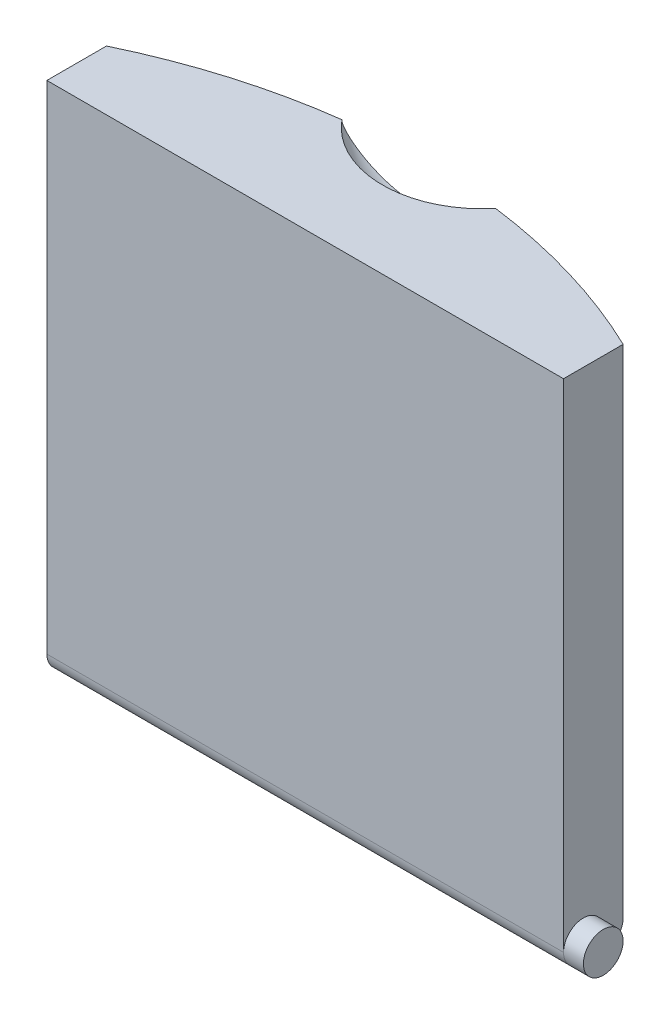
ISO-10303-21;
HEADER;
FILE_DESCRIPTION(('STEP AP214'),'2;1');
FILE_NAME('part.step','',(''),(''),'','','');
FILE_SCHEMA(('AUTOMOTIVE_DESIGN { 1 0 10303 214 1 1 1 1 }'));
ENDSEC;
DATA;
#1=APPLICATION_CONTEXT('core data for automotive mechanical design processes');
#2=APPLICATION_PROTOCOL_DEFINITION('international standard','automotive_design',2000,#1);
#3=PRODUCT_CONTEXT('',#1,'mechanical');
#4=PRODUCT('Part','Part','',(#3));
#5=PRODUCT_RELATED_PRODUCT_CATEGORY('part','',(#4));
#6=PRODUCT_DEFINITION_FORMATION('','',#4);
#7=PRODUCT_DEFINITION_CONTEXT('part definition',#1,'design');
#8=PRODUCT_DEFINITION('design','',#6,#7);
#9=PRODUCT_DEFINITION_SHAPE('','',#8);
#10=(LENGTH_UNIT() NAMED_UNIT(*) SI_UNIT(.MILLI.,.METRE.));
#11=(NAMED_UNIT(*) PLANE_ANGLE_UNIT() SI_UNIT($,.RADIAN.));
#12=(NAMED_UNIT(*) SI_UNIT($,.STERADIAN.) SOLID_ANGLE_UNIT());
#13=UNCERTAINTY_MEASURE_WITH_UNIT(LENGTH_MEASURE(1.E-05),#10,'distance_accuracy_value','');
#14=(GEOMETRIC_REPRESENTATION_CONTEXT(3) GLOBAL_UNCERTAINTY_ASSIGNED_CONTEXT((#13)) GLOBAL_UNIT_ASSIGNED_CONTEXT((#10,
#11,#12)) REPRESENTATION_CONTEXT('',''));
#15=CARTESIAN_POINT('',(0.,0.,0.));
#16=DIRECTION('',(0.,0.,1.));
#17=DIRECTION('',(1.,0.,0.));
#18=AXIS2_PLACEMENT_3D('',#15,#16,#17);
#19=CARTESIAN_POINT('',(70.2962962962964,12.1111111111111,270.370116691915));
#20=DIRECTION('',(0.,1.,0.));
#21=DIRECTION('',(0.,0.,1.));
#22=AXIS2_PLACEMENT_3D('',#19,#20,#21);
#23=CYLINDRICAL_SURFACE('',#22,300.);
#24=CARTESIAN_POINT('',(-4.73346152312547,12.1109111111111,-20.095949211761));
#25=CARTESIAN_POINT('',(-4.7334695884919,12.2096983862572,-20.095947024403));
#26=CARTESIAN_POINT('',(-4.73105456766467,12.3084684488197,-20.0965709593184));
#27=CARTESIAN_POINT('',(-4.72142905882407,12.5057474755002,-20.0990570928781));
#28=CARTESIAN_POINT('',(-4.71421914592804,12.6042564695094,-20.1009191430183));
#29=CARTESIAN_POINT('',(-4.68551061016439,12.8986938685521,-20.1083318173209));
#30=CARTESIAN_POINT('',(-4.65693278073393,13.0939300238274,-20.1157090777853));
#31=CARTESIAN_POINT('',(-4.58251840007666,13.4776466873471,-20.1348996862998));
#32=CARTESIAN_POINT('',(-4.53695599190762,13.666184993572,-20.1466425624954));
#33=CARTESIAN_POINT('',(-4.4299956647076,14.0384692741772,-20.1741731046302));
#34=CARTESIAN_POINT('',(-4.36859028485535,14.2222129456402,-20.1899626762284));
#35=CARTESIAN_POINT('',(-4.21310649708752,14.6329367979812,-20.2298780579377));
#36=CARTESIAN_POINT('',(-4.11468312514153,14.8581635015922,-20.2551034775059));
#37=CARTESIAN_POINT('',(-3.89855776914275,15.2985052212967,-20.3103540222819));
#38=CARTESIAN_POINT('',(-3.78085014094231,15.5136172532179,-20.3403805526247));
#39=CARTESIAN_POINT('',(-3.52862709363782,15.9349017326551,-20.404534404786));
#40=CARTESIAN_POINT('',(-3.39401065022734,16.1410094696354,-20.4386863229663));
#41=CARTESIAN_POINT('',(-3.11138328498631,16.5431765465567,-20.5101573433655));
#42=CARTESIAN_POINT('',(-2.96337251324218,16.7392359990523,-20.5474764100955));
#43=CARTESIAN_POINT('',(-2.66894543627056,17.1061073423181,-20.6214546854569));
#44=CARTESIAN_POINT('',(-2.52340532315973,17.2776676223088,-20.6579142482495));
#45=CARTESIAN_POINT('',(-2.22441823720289,17.6133967073503,-20.7325622883711));
#46=CARTESIAN_POINT('',(-2.07096973554215,17.7775640716547,-20.7707510998161));
#47=CARTESIAN_POINT('',(-1.75727640700149,18.0991207929627,-20.8485447927769));
#48=CARTESIAN_POINT('',(-1.59702704006541,18.2565054761585,-20.8881506173894));
#49=CARTESIAN_POINT('',(-1.27078778484493,18.5649148964771,-20.9684847713521));
#50=CARTESIAN_POINT('',(-1.10479750620661,18.7159391995707,-21.0092131769938));
#51=CARTESIAN_POINT('',(-0.76766966017575,19.0122925967828,-21.0916181797488));
#52=CARTESIAN_POINT('',(-0.596525924268445,19.157614343917,-21.1332958973478));
#53=CARTESIAN_POINT('',(-0.249942149931736,19.4428158024802,-21.2173659638907));
#54=CARTESIAN_POINT('',(-0.0745020936002573,19.5826954912268,-21.2597583158121));
#55=CARTESIAN_POINT('',(0.28005589749429,19.8573625308599,-21.3450857117869));
#56=CARTESIAN_POINT('',(0.459172173927706,19.9921521032006,-21.3880205079257));
#57=CARTESIAN_POINT('',(0.820711140318799,20.2570727904066,-21.4743240956355));
#58=CARTESIAN_POINT('',(1.00313388316235,20.3872038306609,-21.5176928941433));
#59=CARTESIAN_POINT('',(1.48111923160502,20.719841522649,-21.6308468241577));
#60=CARTESIAN_POINT('',(1.77896644355572,20.918984101038,-21.7008866454378));
#61=CARTESIAN_POINT('',(2.38093298991359,21.3074094751973,-21.8414487996863));
#62=CARTESIAN_POINT('',(2.68505307301763,21.4966910843967,-21.9119711895724));
#63=CARTESIAN_POINT('',(3.29871655644645,21.8664424899686,-22.0532467270682));
#64=CARTESIAN_POINT('',(3.60826210808194,22.0469086782828,-22.1239999567266));
#65=CARTESIAN_POINT('',(4.23192167684937,22.3997865487912,-22.2654941180392));
#66=CARTESIAN_POINT('',(4.54603595249368,22.5721977728678,-22.3362350487664));
#67=CARTESIAN_POINT('',(5.49547269277588,23.079066813153,-22.5484284049256));
#68=CARTESIAN_POINT('',(6.13676754298007,23.4024925209109,-22.6895928962908));
#69=CARTESIAN_POINT('',(7.43146861884931,24.0244083086187,-22.9700482707284));
#70=CARTESIAN_POINT('',(8.08487244824584,24.322903259118,-23.1093395152819));
#71=CARTESIAN_POINT('',(9.40482040521669,24.8998293624154,-23.3860493913176));
#72=CARTESIAN_POINT('',(10.0714134218945,25.1781543858174,-23.523455411003));
#73=CARTESIAN_POINT('',(11.4128665309879,25.7157351046555,-23.795160182151));
#74=CARTESIAN_POINT('',(12.0877268944333,25.9749901729559,-23.9294588313249));
#75=CARTESIAN_POINT('',(13.4436841909707,26.4761902401912,-24.1944045938572));
#76=CARTESIAN_POINT('',(14.1247736177482,26.7181535960314,-24.3250554870889));
#77=CARTESIAN_POINT('',(15.4929372014266,27.1866863852655,-24.5825514671789));
#78=CARTESIAN_POINT('',(16.1800114653224,27.4132555428071,-24.7093964858162));
#79=CARTESIAN_POINT('',(17.8411308951455,27.9419914283048,-25.0100282505886));
#80=CARTESIAN_POINT('',(18.8177453258962,28.2372297746567,-25.1818228034267));
#81=CARTESIAN_POINT('',(20.7796934641179,28.8026265566719,-25.5168492868617));
#82=CARTESIAN_POINT('',(21.7650277013372,29.0727834569625,-25.6800806929957));
#83=CARTESIAN_POINT('',(23.7433746817779,29.5902394378712,-25.997610004687));
#84=CARTESIAN_POINT('',(24.7363893379293,29.8375326113254,-26.1519055977263));
#85=CARTESIAN_POINT('',(26.7288728618958,30.3108951090491,-26.4512008960061));
#86=CARTESIAN_POINT('',(27.7283418993895,30.5369638729048,-26.5962003557576));
#87=CARTESIAN_POINT('',(29.734252836136,30.9695180964152,-26.87683055044));
#88=CARTESIAN_POINT('',(30.7407023473301,31.1759766114796,-27.012448327356));
#89=CARTESIAN_POINT('',(32.758576476484,31.5700646059716,-27.2738899409966));
#90=CARTESIAN_POINT('',(33.7700012593262,31.7576934569068,-27.3997134507788));
#91=CARTESIAN_POINT('',(35.7972273563466,32.1150079241701,-27.641386938096));
#92=CARTESIAN_POINT('',(36.8130287930309,32.2846930347977,-27.7572366345265));
#93=CARTESIAN_POINT('',(38.8484607195466,32.6068414731793,-27.9788093530963));
#94=CARTESIAN_POINT('',(39.8680912272603,32.7593047204008,-28.0845323278811));
#95=CARTESIAN_POINT('',(41.9110016634842,33.0476474555265,-28.2857535834271));
#96=CARTESIAN_POINT('',(42.9342825629843,33.1835221299912,-28.3812488954866));
#97=CARTESIAN_POINT('',(44.9836898426946,33.4391183081134,-28.5618656467961));
#98=CARTESIAN_POINT('',(46.0098159997389,33.5588410439959,-28.6469878773564));
#99=CARTESIAN_POINT('',(48.06464896206,33.782556751845,-28.806780549033));
#100=CARTESIAN_POINT('',(49.0933558975396,33.8865489132779,-28.881450451568));
#101=CARTESIAN_POINT('',(51.1529278710281,34.0791249991094,-29.0202587014421));
#102=CARTESIAN_POINT('',(52.1837929532176,34.1677086048865,-29.0843968310014));
#103=CARTESIAN_POINT('',(55.2774724173929,34.4106350381274,-29.2608218919385));
#104=CARTESIAN_POINT('',(57.3430369981981,34.5423337777745,-29.3572491681165));
#105=CARTESIAN_POINT('',(61.4785491956894,34.7468099812234,-29.5074067546533));
#106=CARTESIAN_POINT('',(63.5484967831667,34.8195878364506,-29.5611373486563));
#107=CARTESIAN_POINT('',(67.7556776447659,34.9083855599795,-29.6267329149938));
#108=CARTESIAN_POINT('',(69.892972390414,34.9225413401037,-29.6372228570496));
#109=CARTESIAN_POINT('',(74.1668350967768,34.8891469380011,-29.6125256928833));
#110=CARTESIAN_POINT('',(76.3034030482676,34.8415959998747,-29.5773380271162));
#111=CARTESIAN_POINT('',(80.5742105998409,34.6842072680419,-29.461386281356));
#112=CARTESIAN_POINT('',(82.7084482459433,34.5743348717466,-29.3805968821469));
#113=CARTESIAN_POINT('',(86.9704543399436,34.2909892457817,-29.1737438551047));
#114=CARTESIAN_POINT('',(89.0982229154546,34.117517279035,-29.0476811262838));
#115=CARTESIAN_POINT('',(93.337266514406,33.7054661429322,-28.7512839047222));
#116=CARTESIAN_POINT('',(95.4485728579028,33.4671054523124,-28.5810980633858));
#117=CARTESIAN_POINT('',(98.6058574955678,33.0580109142531,-28.2930486093381));
#118=CARTESIAN_POINT('',(99.6567439057247,32.9130422808343,-28.1915623782446));
#119=CARTESIAN_POINT('',(101.75480189027,32.605330642963,-27.9777911363522));
#120=CARTESIAN_POINT('',(102.80197355257,32.4425880620766,-27.8655063828976));
#121=CARTESIAN_POINT('',(104.891197081792,32.0987842823108,-27.6303816039707));
#122=CARTESIAN_POINT('',(105.933252526303,31.9177386736955,-27.5075505748895));
#123=CARTESIAN_POINT('',(108.012515194641,31.536370084325,-27.2514282142202));
#124=CARTESIAN_POINT('',(109.049722560895,31.3360476736674,-27.1181371920003));
#125=CARTESIAN_POINT('',(111.118449105591,30.9151135552266,-26.8413244091196));
#126=CARTESIAN_POINT('',(112.149969261957,30.6945054587406,-26.6978044704496));
#127=CARTESIAN_POINT('',(114.206670335751,30.2316820483061,-26.4007687602076));
#128=CARTESIAN_POINT('',(115.231851591966,29.9894678999679,-26.2472535279856));
#129=CARTESIAN_POINT('',(116.703631576821,29.6237450311961,-26.0190985253485));
#130=CARTESIAN_POINT('',(117.153178676231,29.5096020221341,-25.9483591437571));
#131=CARTESIAN_POINT('',(118.050748228508,29.2766276267556,-25.8050322648444));
#132=CARTESIAN_POINT('',(118.498770720377,29.1577963613716,-25.7324448152105));
#133=CARTESIAN_POINT('',(119.840377975944,28.7940049104076,-25.5119634941138));
#134=CARTESIAN_POINT('',(120.731550576531,28.5417351718402,-25.3613431970095));
#135=CARTESIAN_POINT('',(122.505570721498,28.0161985528312,-25.0533106759725));
#136=CARTESIAN_POINT('',(123.388425290867,27.7429515902381,-24.8959049555779));
#137=CARTESIAN_POINT('',(125.145353629429,27.1730067124602,-24.5745869902812));
#138=CARTESIAN_POINT('',(126.019427626336,26.8763094072077,-24.4106749146614));
#139=CARTESIAN_POINT('',(127.500847439497,26.3478920137208,-24.1261118403455));
#140=CARTESIAN_POINT('',(128.11084973419,26.1228069472577,-24.0069551241233));
#141=CARTESIAN_POINT('',(129.324779564607,25.6581876267424,-23.7659419940594));
#142=CARTESIAN_POINT('',(129.928707319054,25.4186538951258,-23.6440856779305));
#143=CARTESIAN_POINT('',(131.130607295294,24.9230356368273,-23.3977569552379));
#144=CARTESIAN_POINT('',(131.728566019711,24.6669205251572,-23.2732800175639));
#145=CARTESIAN_POINT('',(132.915924053508,24.1364968923509,-23.0223685781157));
#146=CARTESIAN_POINT('',(133.50532378567,23.8621892736066,-22.8959341736747));
#147=CARTESIAN_POINT('',(134.707631495131,23.2762074046862,-22.6342855590252));
#148=CARTESIAN_POINT('',(135.319920405397,22.9632886848891,-22.4989874197743));
#149=CARTESIAN_POINT('',(136.227235748823,22.473258962688,-22.2955757020036));
#150=CARTESIAN_POINT('',(136.527885231037,22.3064353354677,-22.2276795929973));
#151=CARTESIAN_POINT('',(137.124873675402,21.9652512691,-22.0919063070959));
#152=CARTESIAN_POINT('',(137.421212862978,21.7908912260126,-22.0240291293942));
#153=CARTESIAN_POINT('',(138.007957025229,21.4344541906323,-21.8887092778429));
#154=CARTESIAN_POINT('',(138.298378141761,21.2524040886462,-21.8212659087855));
#155=CARTESIAN_POINT('',(138.873436741858,20.8791627126499,-21.6868349269838));
#156=CARTESIAN_POINT('',(139.158073883634,20.6879709006613,-21.6198473413275));
#157=CARTESIAN_POINT('',(139.720254260332,20.2955511218043,-21.4866931317029));
#158=CARTESIAN_POINT('',(139.997802324874,20.0943302790938,-21.4205259655209));
#159=CARTESIAN_POINT('',(140.544551829201,19.6805334114887,-21.2893792562621));
#160=CARTESIAN_POINT('',(140.81375481669,19.4679595123207,-21.2243994938948));
#161=CARTESIAN_POINT('',(141.290231121786,19.0728858336972,-21.1087144575895));
#162=CARTESIAN_POINT('',(141.49930633385,18.8926511908659,-21.0577062643313));
#163=CARTESIAN_POINT('',(141.909596128928,18.5230229587074,-20.9571561125456));
#164=CARTESIAN_POINT('',(142.110810808131,18.3336294815196,-20.907614136078));
#165=CARTESIAN_POINT('',(142.504378577505,17.9441239876299,-20.8102982840117));
#166=CARTESIAN_POINT('',(142.696701797767,17.7439801250171,-20.7625304611633));
#167=CARTESIAN_POINT('',(143.069704705894,17.3325014693202,-20.6695162873774));
#168=CARTESIAN_POINT('',(143.250384365841,17.1211666494055,-20.6242699424858));
#169=CARTESIAN_POINT('',(143.60044342446,16.6824777742166,-20.5362860237893));
#170=CARTESIAN_POINT('',(143.769568530738,16.4549075156264,-20.4936064899187));
#171=CARTESIAN_POINT('',(144.089352845068,15.9861877071593,-20.4126407369224));
#172=CARTESIAN_POINT('',(144.240007515754,15.7450348417875,-20.3743555974511));
#173=CARTESIAN_POINT('',(144.517160617396,15.2507711421026,-20.3037273417448));
#174=CARTESIAN_POINT('',(144.643837420244,14.9977676171846,-20.2713404229233));
#175=CARTESIAN_POINT('',(144.86913216992,14.4788386097573,-20.213616042087));
#176=CARTESIAN_POINT('',(144.967779863654,14.2129271799247,-20.1882711071491));
#177=CARTESIAN_POINT('',(145.094184357413,13.7945660347037,-20.1557479721014));
#178=CARTESIAN_POINT('',(145.133728213506,13.6458507567643,-20.145562812175));
#179=CARTESIAN_POINT('',(145.202238231104,13.3458705893721,-20.1279058691409));
#180=CARTESIAN_POINT('',(145.231208161787,13.1946066285759,-20.1204331191738));
#181=CARTESIAN_POINT('',(145.278198069436,12.8885136078992,-20.1083077024476));
#182=CARTESIAN_POINT('',(145.296090631493,12.7336635775313,-20.1036878519976));
#183=CARTESIAN_POINT('',(145.320051240431,12.4228550098589,-20.0974997884138));
#184=CARTESIAN_POINT('',(145.326108671517,12.266895603181,-20.0959343149764));
#185=CARTESIAN_POINT('',(145.326054115718,12.1109111111111,-20.095949211761));
#186=B_SPLINE_CURVE_WITH_KNOTS('',3,(#24,#25,#26,#27,#28,#29,#30,#31,#32,#33,#34,#35,#36,#37,
#38,#39,#40,#41,#42,#43,#44,#45,#46,#47,#48,#49,#50,#51,#52,#53,#54,#55,#56,#57,#58,#59,#60,#61,
#62,#63,#64,#65,#66,#67,#68,#69,#70,#71,#72,#73,#74,#75,#76,#77,#78,#79,#80,#81,#82,#83,#84,#85,
#86,#87,#88,#89,#90,#91,#92,#93,#94,#95,#96,#97,#98,#99,#100,#101,#102,#103,#104,#105,#106,#107,
#108,#109,#110,#111,#112,#113,#114,#115,#116,#117,#118,#119,#120,#121,#122,#123,#124,#125,#126,
#127,#128,#129,#130,#131,#132,#133,#134,#135,#136,#137,#138,#139,#140,#141,#142,#143,#144,#145,
#146,#147,#148,#149,#150,#151,#152,#153,#154,#155,#156,#157,#158,#159,#160,#161,#162,#163,#164,
#165,#166,#167,#168,#169,#170,#171,#172,#173,#174,#175,#176,#177,#178,#179,#180,#181,#182,#183,
#184,#185),.UNSPECIFIED.,.F.,.F.,(4,2,2,2,2,2,2,2,2,2,2,2,2,2,2,2,2,2,2,2,2,2,2,2,2,2,2,2,2,2,2,
2,2,2,2,2,2,2,2,2,2,2,2,2,2,2,2,2,2,2,2,2,2,2,2,2,2,2,2,2,2,2,2,2,2,2,2,2,2,2,2,2,2,2,2,2,2,2,2,
2,4),(0.,0.296296616138595,0.592557699757765,1.18389327835434,1.76607074761856,2.34852287970563,
3.0885737489466,3.82884160570937,4.57376382979437,5.31867770789342,6.00212518549242,
6.68570528337368,7.36974912720267,8.05383957446097,8.73878423330625,9.42373174669111,
10.1083767933527,10.793032800374,11.8880101063659,12.9831188681172,14.0786721538727,
15.1742876724225,17.3695060832883,19.5642946214733,21.7698996496186,23.9755771790172,
26.1788772610325,28.3822168141084,31.4856584799004,34.5892899992584,37.6937211574892,
40.7982342627264,43.9069530832342,47.0157756314102,50.1246857707984,53.2336104473742,
56.3434350948388,59.4530223606976,62.562769796634,65.6725815289641,71.8871657606571,
78.1017087070671,84.512414730783,90.9231992855934,97.3375467735456,103.75176689605,
110.144652046024,113.341526649915,116.538325086588,119.732423117528,122.926426714345,
126.119862805198,129.313126719596,130.720627261731,132.128091521412,134.942869878321,
137.755007898205,140.567072799777,142.550007466456,144.532870477015,146.519501332277,
148.506033719502,150.607776330162,151.659104042798,152.710376572204,153.758236202612,
154.806157574333,155.853344875767,156.90033678642,157.742247607556,158.584148123064,
159.428697246342,160.273248394543,161.132636875973,161.99223604979,162.845165067486,
163.697185473165,164.159496802156,164.621643174512,165.089011054597,165.556797959074),.UNSPECIFIED.);
#187=CARTESIAN_POINT('',(-4.73346152642158,12.111111111111,-20.0959492109096));
#188=VERTEX_POINT('',#187);
#189=CARTESIAN_POINT('',(145.326054119014,12.111111111111,-20.0959492109096));
#190=VERTEX_POINT('',#189);
#191=EDGE_CURVE('E52',#188,#190,#186,.T.);
#192=ORIENTED_EDGE('',*,*,#191,.F.);
#193=CARTESIAN_POINT('',(70.2962962962964,12.1111111111111,270.370116691915));
#194=DIRECTION('',(0.,1.,0.));
#195=DIRECTION('',(0.,0.,-1.));
#196=AXIS2_PLACEMENT_3D('',#193,#194,#195);
#197=CIRCLE('',#196,300.);
#198=CARTESIAN_POINT('',(-59.7037037037036,12.1111111111111,0.));
#199=VERTEX_POINT('',#198);
#200=EDGE_CURVE('E113',#188,#199,#197,.T.);
#201=ORIENTED_EDGE('',*,*,#200,.T.);
#202=DIRECTION('',(0.,-1.,0.));
#203=VECTOR('',#202,1.);
#204=CARTESIAN_POINT('',(-59.7037037037036,62.1111111111111,0.));
#205=LINE('',#204,#203);
#206=CARTESIAN_POINT('',(-59.7037037037036,62.1111111111111,0.));
#207=VERTEX_POINT('',#206);
#208=EDGE_CURVE('E150',#207,#199,#205,.T.);
#209=ORIENTED_EDGE('',*,*,#208,.F.);
#210=CARTESIAN_POINT('',(70.2962962962964,62.1111111111111,270.370116691915));
#211=DIRECTION('',(0.,1.,0.));
#212=DIRECTION('',(0.,0.,-1.));
#213=AXIS2_PLACEMENT_3D('',#210,#211,#212);
#214=CIRCLE('',#213,300.);
#215=CARTESIAN_POINT('',(31.6497732610472,62.1111111111111,-27.1302131520797));
#216=VERTEX_POINT('',#215);
#217=EDGE_CURVE('E125',#216,#207,#214,.T.);
#218=ORIENTED_EDGE('',*,*,#217,.F.);
#219=CARTESIAN_POINT('',(31.6497732662168,62.1113111111111,-27.1302131527513));
#220=CARTESIAN_POINT('',(31.6497657602665,62.0542944340853,-27.1302121510557));
#221=CARTESIAN_POINT('',(31.6510284449783,61.9972855587162,-27.1303762083219));
#222=CARTESIAN_POINT('',(31.6560518647063,61.8833885477892,-27.1310287175023));
#223=CARTESIAN_POINT('',(31.6598122063819,61.8265003946344,-27.1315171183377));
#224=CARTESIAN_POINT('',(31.6747550339622,61.656396034448,-27.1334575003603));
#225=CARTESIAN_POINT('',(31.6895996814099,61.5434898039308,-27.1353847095394));
#226=CARTESIAN_POINT('',(31.7279398865754,61.3211492588254,-27.1403574829236));
#227=CARTESIAN_POINT('',(31.7512879320347,61.2116884173703,-27.1433839750938));
#228=CARTESIAN_POINT('',(31.8056272938067,60.9946742865612,-27.1504189892437));
#229=CARTESIAN_POINT('',(31.8366228684209,60.8871220958702,-27.154428058334));
#230=CARTESIAN_POINT('',(31.9338801123586,60.584820729707,-27.1669886084335));
#231=CARTESIAN_POINT('',(32.0079133298107,60.3926118888772,-27.1765293309198));
#232=CARTESIAN_POINT('',(32.1719440234056,60.0152635045126,-27.1975909125547));
#233=CARTESIAN_POINT('',(32.2619565388321,59.8301308221168,-27.2091136367895));
#234=CARTESIAN_POINT('',(32.454714522387,59.4638982187632,-27.2336874596981));
#235=CARTESIAN_POINT('',(32.5576011751289,59.2828744373235,-27.2467553995385));
#236=CARTESIAN_POINT('',(32.7185329922212,59.0154807264556,-27.2671031659515));
#237=CARTESIAN_POINT('',(32.7732671254053,58.9270548639253,-27.2740087959582));
#238=CARTESIAN_POINT('',(32.884687124821,58.7514560732066,-27.2880339594032));
#239=CARTESIAN_POINT('',(32.941372998242,58.6642831496351,-27.2951534936293));
#240=CARTESIAN_POINT('',(33.1054024981281,58.417446226764,-27.3157058201406));
#241=CARTESIAN_POINT('',(33.2148281402276,58.2591829088088,-27.3293582909494));
#242=CARTESIAN_POINT('',(33.4384796572593,57.9461149995279,-27.3571310745442));
#243=CARTESIAN_POINT('',(33.5527061589568,57.791310863874,-27.371251448365));
#244=CARTESIAN_POINT('',(33.7852459479088,57.4847354660483,-27.3998564933146));
#245=CARTESIAN_POINT('',(33.9035610013754,57.3329655604742,-27.4143413211301));
#246=CARTESIAN_POINT('',(34.1436896264477,57.0322421917053,-27.4435896300361));
#247=CARTESIAN_POINT('',(34.2655033776335,56.8832888737325,-27.4583531254165));
#248=CARTESIAN_POINT('',(34.6360012292031,56.4397918148708,-27.5030194818624));
#249=CARTESIAN_POINT('',(34.8893288691524,56.1491497030627,-27.5332473163816));
#250=CARTESIAN_POINT('',(35.4060630176119,55.5772012525494,-27.5942089532053));
#251=CARTESIAN_POINT('',(35.6694671296936,55.2958927234465,-27.6249426342288));
#252=CARTESIAN_POINT('',(36.2049692689094,54.7420082020377,-27.6866799553259));
#253=CARTESIAN_POINT('',(36.477062590081,54.4694276377661,-27.7176834428721));
#254=CARTESIAN_POINT('',(37.0291931434069,53.9324360443625,-27.7798070778108));
#255=CARTESIAN_POINT('',(37.3092307299811,53.6680253808197,-27.8109272303542));
#256=CARTESIAN_POINT('',(37.8763141013074,53.1474200540658,-27.8731163089145));
#257=CARTESIAN_POINT('',(38.1633524410559,52.8912172802696,-27.9041852547965));
#258=CARTESIAN_POINT('',(38.7442303070713,52.3866186851293,-27.9661909897243));
#259=CARTESIAN_POINT('',(39.0380700990634,52.1382231697031,-27.9971277735506));
#260=CARTESIAN_POINT('',(39.8422298741481,51.4762469678217,-28.0805653644337));
#261=CARTESIAN_POINT('',(40.3586983580539,51.070066293811,-28.1328451540312));
#262=CARTESIAN_POINT('',(41.4087128789702,50.2802784001795,-28.2362900358936));
#263=CARTESIAN_POINT('',(41.942260644689,49.8966734768264,-28.2874550144345));
#264=CARTESIAN_POINT('',(43.567311217246,48.7794931502065,-28.4387590049711));
#265=CARTESIAN_POINT('',(44.6827162698042,48.0799660082835,-28.5366541514163));
#266=CARTESIAN_POINT('',(46.9661307859978,46.7754461096714,-28.7235386962906));
#267=CARTESIAN_POINT('',(48.1340745368093,46.1703392714913,-28.8125387944852));
#268=CARTESIAN_POINT('',(50.5154634013297,45.0564389681699,-28.9794159006333));
#269=CARTESIAN_POINT('',(51.7288972904473,44.5476219287126,-29.057295630001));
#270=CARTESIAN_POINT('',(54.211349325889,43.6220156629277,-29.2009812020596));
#271=CARTESIAN_POINT('',(55.4809207405309,43.206680593099,-29.2665938844701));
#272=CARTESIAN_POINT('',(58.0502402797813,42.4799255880258,-29.3825944945921));
#273=CARTESIAN_POINT('',(59.3499906687369,42.1685134773084,-29.432981275894));
#274=CARTESIAN_POINT('',(61.9716438568418,41.6512618175675,-29.5172306331986));
#275=CARTESIAN_POINT('',(63.2935590765946,41.4454836538372,-29.551083600628));
#276=CARTESIAN_POINT('',(65.9499720501047,41.1409584811898,-29.6013390831439));
#277=CARTESIAN_POINT('',(67.2844697598499,41.0422110980308,-29.6177416592471));
#278=CARTESIAN_POINT('',(70.0000068746385,40.950883789098,-29.6329067044519));
#279=CARTESIAN_POINT('',(71.3811685697507,40.9618038393408,-29.6310876446551));
#280=CARTESIAN_POINT('',(74.1377125246578,41.0981917055846,-29.6084550320165));
#281=CARTESIAN_POINT('',(75.5130945500114,41.2236641239775,-29.5876407159989));
#282=CARTESIAN_POINT('',(78.2485757787108,41.5884251692054,-29.5275879838845));
#283=CARTESIAN_POINT('',(79.6086717185665,41.8277376448781,-29.4883457072581));
#284=CARTESIAN_POINT('',(82.3035403764077,42.4187063465456,-29.3925294635252));
#285=CARTESIAN_POINT('',(83.6383143333086,42.7703570611302,-29.3359563466902));
#286=CARTESIAN_POINT('',(86.2754315043279,43.5846303418529,-29.2069403322959));
#287=CARTESIAN_POINT('',(87.5777125192678,44.0474500416462,-29.1344692632506));
#288=CARTESIAN_POINT('',(90.1380434982927,45.081088446547,-28.9757550947052));
#289=CARTESIAN_POINT('',(91.396085543632,45.6519263713259,-28.8895095447397));
#290=CARTESIAN_POINT('',(93.8572731199352,46.8979623166505,-28.7057950238282));
#291=CARTESIAN_POINT('',(95.0604704630753,47.5730590809196,-28.6083369656558));
#292=CARTESIAN_POINT('',(96.8169262334419,48.6613969738452,-28.4559234601042));
#293=CARTESIAN_POINT('',(97.3942642583286,49.0367241204344,-28.4040902131283));
#294=CARTESIAN_POINT('',(98.5317658070446,49.8124093053452,-28.2987370351605));
#295=CARTESIAN_POINT('',(99.0919300862149,50.212766240438,-28.2452171785602));
#296=CARTESIAN_POINT('',(100.038897519787,50.922370125195,-28.1521375124263));
#297=CARTESIAN_POINT('',(100.430224365178,51.2256445974493,-28.1128763128027));
#298=CARTESIAN_POINT('',(101.202530557595,51.8449808106103,-28.033896848757));
#299=CARTESIAN_POINT('',(101.583510970188,52.1610412262958,-27.9941786320071));
#300=CARTESIAN_POINT('',(102.333306089199,52.8051383792065,-27.9145992100026));
#301=CARTESIAN_POINT('',(102.702152277984,53.1331385481324,-27.874738731356));
#302=CARTESIAN_POINT('',(103.427804452169,53.8022027071537,-27.7949992148745));
#303=CARTESIAN_POINT('',(103.78461089326,54.143266201772,-27.7551201778001));
#304=CARTESIAN_POINT('',(104.375746290714,54.7307064895921,-27.6880152008332));
#305=CARTESIAN_POINT('',(104.613625529853,54.9735079668217,-27.6607148968665));
#306=CARTESIAN_POINT('',(105.082285127068,55.4658927340096,-27.6063767015629));
#307=CARTESIAN_POINT('',(105.313065730011,55.7154757894768,-27.5793388011964));
#308=CARTESIAN_POINT('',(105.767945650263,56.2234841452457,-27.5255274997102));
#309=CARTESIAN_POINT('',(105.991995650623,56.4819540802355,-27.4987567164742));
#310=CARTESIAN_POINT('',(106.320725380337,56.8757851919582,-27.4591174424294));
#311=CARTESIAN_POINT('',(106.429067241982,57.0080696828189,-27.4459917923781));
#312=CARTESIAN_POINT('',(106.643035819386,57.2748728366941,-27.419953907094));
#313=CARTESIAN_POINT('',(106.748662070291,57.4093918758114,-27.4070417085326));
#314=CARTESIAN_POINT('',(107.020839968985,57.7642783775488,-27.3736263335631));
#315=CARTESIAN_POINT('',(107.184924885616,57.9865810471773,-27.3533366629994));
#316=CARTESIAN_POINT('',(107.423292180874,58.3255176916257,-27.3236733193207));
#317=CARTESIAN_POINT('',(107.501448924617,58.4394014365133,-27.3139147812122));
#318=CARTESIAN_POINT('',(107.654755203517,58.6691977501346,-27.2947141289731));
#319=CARTESIAN_POINT('',(107.72990495051,58.7851101751214,-27.2852719925601));
#320=CARTESIAN_POINT('',(107.875749708836,59.0177235100591,-27.2668938025434));
#321=CARTESIAN_POINT('',(107.94648872559,59.1343963618062,-27.2579528915961));
#322=CARTESIAN_POINT('',(108.083831757685,59.3701757014769,-27.2405466802636));
#323=CARTESIAN_POINT('',(108.150436326074,59.4892818610624,-27.232081316281));
#324=CARTESIAN_POINT('',(108.278597335711,59.7301549242505,-27.2157515495078));
#325=CARTESIAN_POINT('',(108.340156446166,59.8519203772531,-27.2078868291099));
#326=CARTESIAN_POINT('',(108.457086668278,60.0984162607348,-27.1929145333226));
#327=CARTESIAN_POINT('',(108.512459394318,60.2231459073342,-27.1858067604251));
#328=CARTESIAN_POINT('',(108.620480694742,60.4878918364222,-27.1719141702656));
#329=CARTESIAN_POINT('',(108.672363015234,60.6282297305332,-27.1652251569387));
#330=CARTESIAN_POINT('',(108.764471227823,60.9126381823461,-27.1533305931358));
#331=CARTESIAN_POINT('',(108.804712328272,61.0567035996486,-27.1481231073077));
#332=CARTESIAN_POINT('',(108.854736175514,61.2767055365783,-27.1416427445742));
#333=CARTESIAN_POINT('',(108.869782451117,61.3514418138355,-27.1396921194115));
#334=CARTESIAN_POINT('',(108.895861473551,61.5016240479133,-27.1363096938356));
#335=CARTESIAN_POINT('',(108.9068946392,61.5770699298343,-27.1348778392824));
#336=CARTESIAN_POINT('',(108.924717253448,61.7288259604119,-27.1325642715926));
#337=CARTESIAN_POINT('',(108.931486900407,61.8051384900955,-27.131685125508));
#338=CARTESIAN_POINT('',(108.940551264189,61.9580681528624,-27.1305077816112));
#339=CARTESIAN_POINT('',(108.942843864727,62.0346854128527,-27.1302098585413));
#340=CARTESIAN_POINT('',(108.942819326376,62.1113111111111,-27.1302131527513));
#341=B_SPLINE_CURVE_WITH_KNOTS('',3,(#219,#220,#221,#222,#223,#224,#225,#226,#227,#228,#229,
#230,#231,#232,#233,#234,#235,#236,#237,#238,#239,#240,#241,#242,#243,#244,#245,#246,#247,#248,
#249,#250,#251,#252,#253,#254,#255,#256,#257,#258,#259,#260,#261,#262,#263,#264,#265,#266,#267,
#268,#269,#270,#271,#272,#273,#274,#275,#276,#277,#278,#279,#280,#281,#282,#283,#284,#285,#286,
#287,#288,#289,#290,#291,#292,#293,#294,#295,#296,#297,#298,#299,#300,#301,#302,#303,#304,#305,
#306,#307,#308,#309,#310,#311,#312,#313,#314,#315,#316,#317,#318,#319,#320,#321,#322,#323,#324,
#325,#326,#327,#328,#329,#330,#331,#332,#333,#334,#335,#336,#337,#338,#339,#340),.UNSPECIFIED.,
.F.,.F.,(4,2,2,2,2,2,2,2,2,2,2,2,2,2,2,2,2,2,2,2,2,2,2,2,2,2,2,2,2,2,2,2,2,2,2,2,2,2,2,2,2,2,2,
2,2,2,2,2,2,2,2,2,2,2,2,2,2,2,2,2,4),(0.,0.171020735591591,0.342014544573855,0.683254438333456,
1.01883659607134,1.35460603623348,1.97205132820165,2.59008085407575,3.21560579274684,
3.52825932162822,3.84091400231544,4.41947235193604,4.99810646999308,5.57699375600963,
6.15591080824558,7.31578547655542,8.47538599294501,9.63436879427303,10.7934033832132,
11.9512549479256,13.1091518252485,15.085841580138,17.0627320456021,21.0184718714326,
24.9693946128746,28.9193488078806,32.9270495995424,36.9350520694111,40.9453810137462,
44.9556959355894,49.0943944133548,53.2332591797039,57.3729913965455,61.5125205457658,
65.659445143575,69.807108298227,73.9507682812579,76.0219205254522,78.0929815445133,
79.5826658213488,81.0721960908802,82.5574954098836,84.0427384488732,85.0656302438931,
86.0884867145999,87.1175797835977,87.6320230854176,88.1465538700009,88.9774118846499,
89.3927774301167,89.8081136620573,90.2182479656837,90.6283272887182,91.038188247389,
91.4479419987997,91.8968606271448,92.3451901018445,92.5738792857321,92.8025445961703,
93.0322642445195,93.2620924543609),.UNSPECIFIED.);
#342=CARTESIAN_POINT('',(108.942819331546,62.1111111111111,-27.1302131520798));
#343=VERTEX_POINT('',#342);
#344=EDGE_CURVE('E47',#216,#343,#341,.T.);
#345=ORIENTED_EDGE('',*,*,#344,.T.);
#346=CARTESIAN_POINT('',(200.296296296296,62.1111111111111,0.));
#347=VERTEX_POINT('',#346);
#348=EDGE_CURVE('E122',#347,#343,#214,.T.);
#349=ORIENTED_EDGE('',*,*,#348,.F.);
#350=DIRECTION('',(0.,1.,0.));
#351=VECTOR('',#350,1.);
#352=CARTESIAN_POINT('',(200.296296296296,12.1111111111111,0.));
#353=LINE('',#352,#351);
#354=CARTESIAN_POINT('',(200.296296296296,12.1111111111111,0.));
#355=VERTEX_POINT('',#354);
#356=EDGE_CURVE('E129',#355,#347,#353,.T.);
#357=ORIENTED_EDGE('',*,*,#356,.F.);
#358=EDGE_CURVE('E116',#355,#190,#197,.T.);
#359=ORIENTED_EDGE('',*,*,#358,.T.);
#360=EDGE_LOOP('',(#192,#201,#209,#218,#345,#349,#357,#359));
#361=FACE_BOUND('',#360,.T.);
#362=ADVANCED_FACE('F39',(#361),#23,.T.);
#363=CARTESIAN_POINT('',(-59.7037037037036,62.1111111111111,30.));
#364=DIRECTION('',(1.,0.,0.));
#365=DIRECTION('',(0.,1.,0.));
#366=AXIS2_PLACEMENT_3D('',#363,#364,#365);
#367=PLANE('',#366);
#368=DIRECTION('',(0.,0.,-1.));
#369=VECTOR('',#368,1.);
#370=CARTESIAN_POINT('',(-59.7037037037036,-197.888888888889,30.));
#371=LINE('',#370,#369);
#372=CARTESIAN_POINT('',(-59.7037037037036,-197.888888888889,20.));
#373=VERTEX_POINT('',#372);
#374=CARTESIAN_POINT('',(-59.7037037037036,-197.888888888889,10.));
#375=VERTEX_POINT('',#374);
#376=EDGE_CURVE('E162',#373,#375,#371,.T.);
#377=ORIENTED_EDGE('',*,*,#376,.F.);
#378=CARTESIAN_POINT('',(-59.7037037037036,-187.888888888889,20.));
#379=DIRECTION('',(1.,0.,0.));
#380=DIRECTION('',(0.,1.,0.));
#381=AXIS2_PLACEMENT_3D('',#378,#379,#380);
#382=CIRCLE('',#381,10.);
#383=CARTESIAN_POINT('',(-59.7037037037036,-187.888888888889,30.));
#384=VERTEX_POINT('',#383);
#385=EDGE_CURVE('E175',#373,#384,#382,.F.);
#386=ORIENTED_EDGE('',*,*,#385,.T.);
#387=DIRECTION('',(0.,-1.,0.));
#388=VECTOR('',#387,1.);
#389=CARTESIAN_POINT('',(-59.7037037037036,62.1111111111111,30.));
#390=LINE('',#389,#388);
#391=CARTESIAN_POINT('',(-59.7037037037036,62.1111111111111,30.));
#392=VERTEX_POINT('',#391);
#393=EDGE_CURVE('E141',#392,#384,#390,.T.);
#394=ORIENTED_EDGE('',*,*,#393,.F.);
#395=DIRECTION('',(0.,0.,-1.));
#396=VECTOR('',#395,1.);
#397=CARTESIAN_POINT('',(-59.7037037037036,62.1111111111111,30.));
#398=LINE('',#397,#396);
#399=EDGE_CURVE('E149',#392,#207,#398,.T.);
#400=ORIENTED_EDGE('',*,*,#399,.T.);
#401=ORIENTED_EDGE('',*,*,#208,.T.);
#402=CARTESIAN_POINT('',(-59.7037037037036,-187.888888888889,0.));
#403=VERTEX_POINT('',#402);
#404=EDGE_CURVE('E137',#199,#403,#205,.T.);
#405=ORIENTED_EDGE('',*,*,#404,.T.);
#406=CARTESIAN_POINT('',(-59.7037037037036,-187.888888888889,10.));
#407=DIRECTION('',(1.,0.,0.));
#408=DIRECTION('',(0.,1.,0.));
#409=AXIS2_PLACEMENT_3D('',#406,#407,#408);
#410=CIRCLE('',#409,10.);
#411=EDGE_CURVE('E173',#403,#375,#410,.F.);
#412=ORIENTED_EDGE('',*,*,#411,.T.);
#413=EDGE_LOOP('',(#377,#386,#394,#400,#401,#405,#412));
#414=FACE_BOUND('',#413,.T.);
#415=ADVANCED_FACE('F206',(#414),#367,.F.);
#416=CARTESIAN_POINT('',(-59.7037037037036,-197.888888888889,30.));
#417=DIRECTION('',(0.,1.,0.));
#418=DIRECTION('',(-1.,0.,0.));
#419=AXIS2_PLACEMENT_3D('',#416,#417,#418);
#420=PLANE('',#419);
#421=DIRECTION('',(0.,0.,-1.));
#422=VECTOR('',#421,1.);
#423=CARTESIAN_POINT('',(200.296296296296,-197.888888888889,30.));
#424=LINE('',#423,#422);
#425=CARTESIAN_POINT('',(200.296296296296,-197.888888888889,20.));
#426=VERTEX_POINT('',#425);
#427=CARTESIAN_POINT('',(200.296296296296,-197.888888888889,10.));
#428=VERTEX_POINT('',#427);
#429=EDGE_CURVE('E159',#426,#428,#424,.T.);
#430=ORIENTED_EDGE('',*,*,#429,.F.);
#431=DIRECTION('',(1.,0.,0.));
#432=VECTOR('',#431,1.);
#433=CARTESIAN_POINT('',(-59.7037037037036,-197.888888888889,20.));
#434=LINE('',#433,#432);
#435=EDGE_CURVE('E171',#426,#373,#434,.F.);
#436=ORIENTED_EDGE('',*,*,#435,.T.);
#437=ORIENTED_EDGE('',*,*,#376,.T.);
#438=DIRECTION('',(1.,0.,0.));
#439=VECTOR('',#438,1.);
#440=CARTESIAN_POINT('',(-59.7037037037036,-197.888888888889,10.));
#441=LINE('',#440,#439);
#442=EDGE_CURVE('E168',#375,#428,#441,.T.);
#443=ORIENTED_EDGE('',*,*,#442,.T.);
#444=EDGE_LOOP('',(#430,#436,#437,#443));
#445=FACE_BOUND('',#444,.T.);
#446=ADVANCED_FACE('F210',(#445),#420,.F.);
#447=CARTESIAN_POINT('',(200.296296296296,62.1111111111111,30.));
#448=DIRECTION('',(-1.,0.,0.));
#449=DIRECTION('',(0.,0.,1.));
#450=AXIS2_PLACEMENT_3D('',#447,#448,#449);
#451=PLANE('',#450);
#452=ORIENTED_EDGE('',*,*,#429,.T.);
#453=CARTESIAN_POINT('',(200.296296296296,-187.888888888889,10.));
#454=DIRECTION('',(-1.,0.,0.));
#455=DIRECTION('',(0.,0.,1.));
#456=AXIS2_PLACEMENT_3D('',#453,#454,#455);
#457=CIRCLE('',#456,10.);
#458=CARTESIAN_POINT('',(200.296296296296,-187.888888888889,0.));
#459=VERTEX_POINT('',#458);
#460=EDGE_CURVE('E177',#428,#459,#457,.F.);
#461=ORIENTED_EDGE('',*,*,#460,.T.);
#462=DIRECTION('',(0.,1.,0.));
#463=VECTOR('',#462,1.);
#464=CARTESIAN_POINT('',(200.296296296296,62.1111111111111,0.));
#465=LINE('',#464,#463);
#466=EDGE_CURVE('E145',#459,#355,#465,.T.);
#467=ORIENTED_EDGE('',*,*,#466,.T.);
#468=ORIENTED_EDGE('',*,*,#356,.T.);
#469=DIRECTION('',(0.,0.,-1.));
#470=VECTOR('',#469,1.);
#471=CARTESIAN_POINT('',(200.296296296296,62.1111111111111,30.));
#472=LINE('',#471,#470);
#473=CARTESIAN_POINT('',(200.296296296296,62.1111111111111,30.));
#474=VERTEX_POINT('',#473);
#475=EDGE_CURVE('E156',#474,#347,#472,.T.);
#476=ORIENTED_EDGE('',*,*,#475,.F.);
#477=DIRECTION('',(0.,1.,0.));
#478=VECTOR('',#477,1.);
#479=CARTESIAN_POINT('',(200.296296296296,62.1111111111111,30.));
#480=LINE('',#479,#478);
#481=CARTESIAN_POINT('',(200.296296296296,-187.888888888889,30.));
#482=VERTEX_POINT('',#481);
#483=EDGE_CURVE('E144',#482,#474,#480,.T.);
#484=ORIENTED_EDGE('',*,*,#483,.F.);
#485=CARTESIAN_POINT('',(200.296296296296,-187.888888888889,20.));
#486=DIRECTION('',(1.,0.,0.));
#487=DIRECTION('',(0.,0.,-1.));
#488=AXIS2_PLACEMENT_3D('',#485,#486,#487);
#489=CIRCLE('',#488,10.);
#490=EDGE_CURVE('E140',#426,#482,#489,.T.);
#491=ORIENTED_EDGE('',*,*,#490,.F.);
#492=EDGE_LOOP('',(#452,#461,#467,#468,#476,#484,#491));
#493=FACE_BOUND('',#492,.T.);
#494=ADVANCED_FACE('F216',(#493),#451,.F.);
#495=CARTESIAN_POINT('',(-59.7037037037036,62.1111111111111,30.));
#496=DIRECTION('',(0.,-1.,0.));
#497=DIRECTION('',(0.,0.,-1.));
#498=AXIS2_PLACEMENT_3D('',#495,#496,#497);
#499=PLANE('',#498);
#500=CARTESIAN_POINT('',(70.2962962962964,62.1111111111111,-58.8547503005703));
#501=DIRECTION('',(0.,-1.,0.));
#502=DIRECTION('',(0.,0.,-1.));
#503=AXIS2_PLACEMENT_3D('',#500,#501,#502);
#504=CIRCLE('',#503,50.);
#505=EDGE_CURVE('E59',#216,#343,#504,.F.);
#506=ORIENTED_EDGE('',*,*,#505,.F.);
#507=ORIENTED_EDGE('',*,*,#217,.T.);
#508=ORIENTED_EDGE('',*,*,#399,.F.);
#509=DIRECTION('',(-1.,0.,0.));
#510=VECTOR('',#509,1.);
#511=CARTESIAN_POINT('',(-59.7037037037036,62.1111111111111,30.));
#512=LINE('',#511,#510);
#513=EDGE_CURVE('E147',#474,#392,#512,.T.);
#514=ORIENTED_EDGE('',*,*,#513,.F.);
#515=ORIENTED_EDGE('',*,*,#475,.T.);
#516=ORIENTED_EDGE('',*,*,#348,.T.);
#517=EDGE_LOOP('',(#506,#507,#508,#514,#515,#516));
#518=FACE_BOUND('',#517,.T.);
#519=ADVANCED_FACE('F223',(#518),#499,.F.);
#520=CARTESIAN_POINT('',(0.,0.,30.));
#521=DIRECTION('',(0.,0.,1.));
#522=DIRECTION('',(1.,0.,0.));
#523=AXIS2_PLACEMENT_3D('',#520,#521,#522);
#524=PLANE('',#523);
#525=ORIENTED_EDGE('',*,*,#393,.T.);
#526=DIRECTION('',(1.,0.,0.));
#527=VECTOR('',#526,1.);
#528=CARTESIAN_POINT('',(200.296296296296,-187.888888888889,30.));
#529=LINE('',#528,#527);
#530=EDGE_CURVE('E165',#384,#482,#529,.T.);
#531=ORIENTED_EDGE('',*,*,#530,.T.);
#532=ORIENTED_EDGE('',*,*,#483,.T.);
#533=ORIENTED_EDGE('',*,*,#513,.T.);
#534=EDGE_LOOP('',(#525,#531,#532,#533));
#535=FACE_BOUND('',#534,.T.);
#536=ADVANCED_FACE('F227',(#535),#524,.T.);
#537=CARTESIAN_POINT('',(0.,0.,0.));
#538=DIRECTION('',(0.,0.,1.));
#539=DIRECTION('',(1.,0.,0.));
#540=AXIS2_PLACEMENT_3D('',#537,#538,#539);
#541=PLANE('',#540);
#542=ORIENTED_EDGE('',*,*,#466,.F.);
#543=DIRECTION('',(1.,0.,0.));
#544=VECTOR('',#543,1.);
#545=CARTESIAN_POINT('',(0.,-187.888888888889,0.));
#546=LINE('',#545,#544);
#547=EDGE_CURVE('E179',#459,#403,#546,.F.);
#548=ORIENTED_EDGE('',*,*,#547,.T.);
#549=ORIENTED_EDGE('',*,*,#404,.F.);
#550=DIRECTION('',(1.,0.,0.));
#551=VECTOR('',#550,1.);
#552=CARTESIAN_POINT('',(-59.7037037037036,12.1111111111111,0.));
#553=LINE('',#552,#551);
#554=EDGE_CURVE('E120',#199,#355,#553,.T.);
#555=ORIENTED_EDGE('',*,*,#554,.T.);
#556=EDGE_LOOP('',(#542,#548,#549,#555));
#557=FACE_BOUND('',#556,.T.);
#558=ADVANCED_FACE('F229',(#557),#541,.F.);
#559=CARTESIAN_POINT('',(210.296296296296,-187.888888888889,20.));
#560=DIRECTION('',(-1.,0.,0.));
#561=DIRECTION('',(0.,0.,1.));
#562=AXIS2_PLACEMENT_3D('',#559,#560,#561);
#563=CYLINDRICAL_SURFACE('',#562,10.);
#564=CARTESIAN_POINT('',(210.296296296296,-187.888888888889,20.));
#565=DIRECTION('',(1.,0.,0.));
#566=DIRECTION('',(0.,0.,-1.));
#567=AXIS2_PLACEMENT_3D('',#564,#565,#566);
#568=CIRCLE('',#567,10.);
#569=CARTESIAN_POINT('',(210.296296296296,-187.888888888889,9.99999999999999));
#570=VERTEX_POINT('',#569);
#571=EDGE_CURVE('E134',#570,#570,#568,.T.);
#572=ORIENTED_EDGE('',*,*,#571,.F.);
#573=EDGE_LOOP('',(#572));
#574=FACE_BOUND('',#573,.T.);
#575=EDGE_CURVE('E133',#482,#426,#489,.T.);
#576=ORIENTED_EDGE('',*,*,#575,.T.);
#577=ORIENTED_EDGE('',*,*,#490,.T.);
#578=EDGE_LOOP('',(#576,#577));
#579=FACE_BOUND('',#578,.T.);
#580=ADVANCED_FACE('F204',(#574,#579),#563,.T.);
#581=CARTESIAN_POINT('',(210.296296296296,-187.888888888889,20.));
#582=DIRECTION('',(1.,0.,0.));
#583=DIRECTION('',(0.,0.,-1.));
#584=AXIS2_PLACEMENT_3D('',#581,#582,#583);
#585=PLANE('',#584);
#586=ORIENTED_EDGE('',*,*,#571,.T.);
#587=EDGE_LOOP('',(#586));
#588=FACE_BOUND('',#587,.T.);
#589=ADVANCED_FACE('F196',(#588),#585,.T.);
#590=CARTESIAN_POINT('',(70.2962962962964,12.1111111111111,270.370116691915));
#591=DIRECTION('',(0.,-1.,0.));
#592=DIRECTION('',(0.,0.,-1.));
#593=AXIS2_PLACEMENT_3D('',#590,#591,#592);
#594=PLANE('',#593);
#595=CARTESIAN_POINT('',(70.2962962962964,12.111111111111,-231.834271154932));
#596=DIRECTION('',(0.,-1.,0.));
#597=DIRECTION('',(0.,0.,-1.));
#598=AXIS2_PLACEMENT_3D('',#595,#596,#597);
#599=CIRCLE('',#598,224.638780130693);
#600=EDGE_CURVE('E11',#190,#188,#599,.T.);
#601=ORIENTED_EDGE('',*,*,#600,.F.);
#602=ORIENTED_EDGE('',*,*,#358,.F.);
#603=ORIENTED_EDGE('',*,*,#554,.F.);
#604=ORIENTED_EDGE('',*,*,#200,.F.);
#605=EDGE_LOOP('',(#601,#602,#603,#604));
#606=FACE_BOUND('',#605,.T.);
#607=ADVANCED_FACE('F118',(#606),#594,.T.);
#608=CARTESIAN_POINT('',(0.,-187.888888888889,20.));
#609=DIRECTION('',(-1.,0.,0.));
#610=DIRECTION('',(0.,-1.,0.));
#611=AXIS2_PLACEMENT_3D('',#608,#609,#610);
#612=CYLINDRICAL_SURFACE('',#611,10.);
#613=ORIENTED_EDGE('',*,*,#385,.F.);
#614=ORIENTED_EDGE('',*,*,#435,.F.);
#615=ORIENTED_EDGE('',*,*,#575,.F.);
#616=ORIENTED_EDGE('',*,*,#530,.F.);
#617=EDGE_LOOP('',(#613,#614,#615,#616));
#618=FACE_BOUND('',#617,.T.);
#619=ADVANCED_FACE('F195',(#618),#612,.T.);
#620=CARTESIAN_POINT('',(-59.7037037037036,-187.888888888889,10.));
#621=DIRECTION('',(1.,0.,0.));
#622=DIRECTION('',(0.,1.,0.));
#623=AXIS2_PLACEMENT_3D('',#620,#621,#622);
#624=CYLINDRICAL_SURFACE('',#623,10.);
#625=ORIENTED_EDGE('',*,*,#411,.F.);
#626=ORIENTED_EDGE('',*,*,#547,.F.);
#627=ORIENTED_EDGE('',*,*,#460,.F.);
#628=ORIENTED_EDGE('',*,*,#442,.F.);
#629=EDGE_LOOP('',(#625,#626,#627,#628));
#630=FACE_BOUND('',#629,.T.);
#631=ADVANCED_FACE('F41',(#630),#624,.T.);
#632=CARTESIAN_POINT('',(70.2962962962964,62.1111111111111,-30.));
#633=DIRECTION('',(1.,0.,0.));
#634=DIRECTION('',(0.,0.,-1.));
#635=AXIS2_PLACEMENT_3D('',#632,#633,#634);
#636=DEGENERATE_TOROIDAL_SURFACE('',#635,28.8547503005703,50.,.F.);
#637=ORIENTED_EDGE('',*,*,#505,.T.);
#638=ORIENTED_EDGE('',*,*,#344,.F.);
#639=EDGE_LOOP('',(#637,#638));
#640=FACE_BOUND('',#639,.T.);
#641=ADVANCED_FACE('F189',(#640),#636,.T.);
#642=CARTESIAN_POINT('',(70.2962962962964,12.111111111111,-30.));
#643=DIRECTION('',(1.,0.,0.));
#644=DIRECTION('',(0.,0.,-1.));
#645=AXIS2_PLACEMENT_3D('',#642,#643,#644);
#646=DEGENERATE_TOROIDAL_SURFACE('',#645,201.834271154932,224.638780130693,.F.);
#647=ORIENTED_EDGE('',*,*,#191,.T.);
#648=ORIENTED_EDGE('',*,*,#600,.T.);
#649=EDGE_LOOP('',(#647,#648));
#650=FACE_BOUND('',#649,.T.);
#651=ADVANCED_FACE('F106',(#650),#646,.T.);
#652=CLOSED_SHELL('',(#362,#415,#446,#494,#519,#536,#558,#580,#589,#607,#619,#631,#641,#651));
#653=MANIFOLD_SOLID_BREP('B2',#652);
#654=ADVANCED_BREP_SHAPE_REPRESENTATION('',(#18,#653),#14);
#655=SHAPE_DEFINITION_REPRESENTATION(#9,#654);
ENDSEC;
END-ISO-10303-21;
